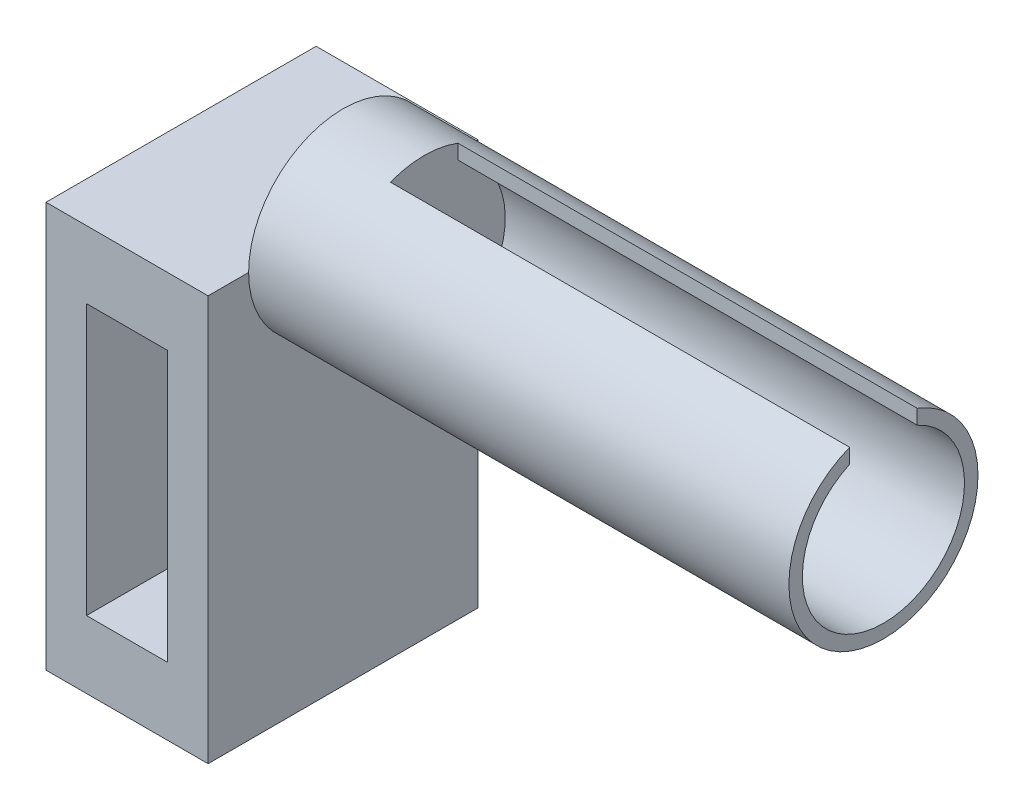
ISO-10303-21;
HEADER;
FILE_DESCRIPTION(('STEP AP214'),'2;1');
FILE_NAME('part.step','',(''),(''),'','','');
FILE_SCHEMA(('AUTOMOTIVE_DESIGN { 1 0 10303 214 1 1 1 1 }'));
ENDSEC;
DATA;
#1=APPLICATION_CONTEXT('core data for automotive mechanical design processes');
#2=APPLICATION_PROTOCOL_DEFINITION('international standard','automotive_design',2000,#1);
#3=PRODUCT_CONTEXT('',#1,'mechanical');
#4=PRODUCT('Part','Part','',(#3));
#5=PRODUCT_RELATED_PRODUCT_CATEGORY('part','',(#4));
#6=PRODUCT_DEFINITION_FORMATION('','',#4);
#7=PRODUCT_DEFINITION_CONTEXT('part definition',#1,'design');
#8=PRODUCT_DEFINITION('design','',#6,#7);
#9=PRODUCT_DEFINITION_SHAPE('','',#8);
#10=(LENGTH_UNIT() NAMED_UNIT(*) SI_UNIT(.MILLI.,.METRE.));
#11=(NAMED_UNIT(*) PLANE_ANGLE_UNIT() SI_UNIT($,.RADIAN.));
#12=(NAMED_UNIT(*) SI_UNIT($,.STERADIAN.) SOLID_ANGLE_UNIT());
#13=UNCERTAINTY_MEASURE_WITH_UNIT(LENGTH_MEASURE(1.E-05),#10,'distance_accuracy_value','');
#14=(GEOMETRIC_REPRESENTATION_CONTEXT(3) GLOBAL_UNCERTAINTY_ASSIGNED_CONTEXT((#13)) GLOBAL_UNIT_ASSIGNED_CONTEXT((#10,
#11,#12)) REPRESENTATION_CONTEXT('',''));
#15=CARTESIAN_POINT('',(0.,0.,0.));
#16=DIRECTION('',(0.,0.,1.));
#17=DIRECTION('',(1.,0.,0.));
#18=AXIS2_PLACEMENT_3D('',#15,#16,#17);
#19=CARTESIAN_POINT('',(3.,7.5,10.));
#20=DIRECTION('',(-1.,0.,0.));
#21=DIRECTION('',(0.,-1.,0.));
#22=AXIS2_PLACEMENT_3D('',#19,#20,#21);
#23=PLANE('',#22);
#24=CARTESIAN_POINT('',(3.,7.5,5.));
#25=DIRECTION('',(1.,0.,0.));
#26=DIRECTION('',(0.,1.,0.));
#27=AXIS2_PLACEMENT_3D('',#24,#25,#26);
#28=CIRCLE('',#27,3.5);
#29=CARTESIAN_POINT('',(3.,7.5,8.5));
#30=VERTEX_POINT('',#29);
#31=CARTESIAN_POINT('',(3.,7.5,1.5));
#32=VERTEX_POINT('',#31);
#33=EDGE_CURVE('E63',#30,#32,#28,.T.);
#34=ORIENTED_EDGE('',*,*,#33,.F.);
#35=DIRECTION('',(0.,0.,-1.));
#36=VECTOR('',#35,1.);
#37=CARTESIAN_POINT('',(3.,7.5,10.));
#38=LINE('',#37,#36);
#39=CARTESIAN_POINT('',(3.,7.5,10.));
#40=VERTEX_POINT('',#39);
#41=EDGE_CURVE('E11',#40,#30,#38,.T.);
#42=ORIENTED_EDGE('',*,*,#41,.F.);
#43=DIRECTION('',(0.,1.,0.));
#44=VECTOR('',#43,1.);
#45=CARTESIAN_POINT('',(3.,7.5,10.));
#46=LINE('',#45,#44);
#47=CARTESIAN_POINT('',(3.,-7.5,10.));
#48=VERTEX_POINT('',#47);
#49=EDGE_CURVE('E223',#48,#40,#46,.T.);
#50=ORIENTED_EDGE('',*,*,#49,.F.);
#51=DIRECTION('',(0.,0.,-1.));
#52=VECTOR('',#51,1.);
#53=CARTESIAN_POINT('',(3.,-7.5,10.));
#54=LINE('',#53,#52);
#55=CARTESIAN_POINT('',(3.,-7.5,0.));
#56=VERTEX_POINT('',#55);
#57=EDGE_CURVE('E237',#48,#56,#54,.T.);
#58=ORIENTED_EDGE('',*,*,#57,.T.);
#59=DIRECTION('',(0.,1.,0.));
#60=VECTOR('',#59,1.);
#61=CARTESIAN_POINT('',(3.,7.5,0.));
#62=LINE('',#61,#60);
#63=CARTESIAN_POINT('',(3.,7.5,0.));
#64=VERTEX_POINT('',#63);
#65=EDGE_CURVE('E213',#56,#64,#62,.T.);
#66=ORIENTED_EDGE('',*,*,#65,.T.);
#67=EDGE_CURVE('E48',#32,#64,#38,.T.);
#68=ORIENTED_EDGE('',*,*,#67,.F.);
#69=EDGE_LOOP('',(#34,#42,#50,#58,#66,#68));
#70=FACE_BOUND('',#69,.T.);
#71=ADVANCED_FACE('F39',(#70),#23,.F.);
#72=CARTESIAN_POINT('',(-3.,7.5,10.));
#73=DIRECTION('',(0.,-1.,0.));
#74=DIRECTION('',(0.,0.,-1.));
#75=AXIS2_PLACEMENT_3D('',#72,#73,#74);
#76=PLANE('',#75);
#77=DIRECTION('',(-1.,0.,0.));
#78=VECTOR('',#77,1.);
#79=CARTESIAN_POINT('',(-3.,7.5,0.));
#80=LINE('',#79,#78);
#81=CARTESIAN_POINT('',(-3.,7.5,0.));
#82=VERTEX_POINT('',#81);
#83=EDGE_CURVE('E241',#64,#82,#80,.T.);
#84=ORIENTED_EDGE('',*,*,#83,.T.);
#85=DIRECTION('',(0.,0.,-1.));
#86=VECTOR('',#85,1.);
#87=CARTESIAN_POINT('',(-3.,7.5,10.));
#88=LINE('',#87,#86);
#89=CARTESIAN_POINT('',(-3.,7.5,10.));
#90=VERTEX_POINT('',#89);
#91=EDGE_CURVE('E255',#90,#82,#88,.T.);
#92=ORIENTED_EDGE('',*,*,#91,.F.);
#93=DIRECTION('',(-1.,0.,0.));
#94=VECTOR('',#93,1.);
#95=CARTESIAN_POINT('',(-3.,7.5,10.));
#96=LINE('',#95,#94);
#97=EDGE_CURVE('E227',#40,#90,#96,.T.);
#98=ORIENTED_EDGE('',*,*,#97,.F.);
#99=ORIENTED_EDGE('',*,*,#41,.T.);
#100=EDGE_CURVE('E47',#30,#32,#38,.T.);
#101=ORIENTED_EDGE('',*,*,#100,.T.);
#102=ORIENTED_EDGE('',*,*,#67,.T.);
#103=EDGE_LOOP('',(#84,#92,#98,#99,#101,#102));
#104=FACE_BOUND('',#103,.T.);
#105=ADVANCED_FACE('F267',(#104),#76,.F.);
#106=CARTESIAN_POINT('',(-3.,7.5,10.));
#107=DIRECTION('',(1.,0.,0.));
#108=DIRECTION('',(0.,1.,0.));
#109=AXIS2_PLACEMENT_3D('',#106,#107,#108);
#110=PLANE('',#109);
#111=DIRECTION('',(0.,-1.,0.));
#112=VECTOR('',#111,1.);
#113=CARTESIAN_POINT('',(-3.,7.5,0.));
#114=LINE('',#113,#112);
#115=CARTESIAN_POINT('',(-3.,-7.5,0.));
#116=VERTEX_POINT('',#115);
#117=EDGE_CURVE('E244',#82,#116,#114,.T.);
#118=ORIENTED_EDGE('',*,*,#117,.T.);
#119=DIRECTION('',(0.,0.,-1.));
#120=VECTOR('',#119,1.);
#121=CARTESIAN_POINT('',(-3.,-7.5,10.));
#122=LINE('',#121,#120);
#123=CARTESIAN_POINT('',(-3.,-7.5,10.));
#124=VERTEX_POINT('',#123);
#125=EDGE_CURVE('E252',#124,#116,#122,.T.);
#126=ORIENTED_EDGE('',*,*,#125,.F.);
#127=DIRECTION('',(0.,-1.,0.));
#128=VECTOR('',#127,1.);
#129=CARTESIAN_POINT('',(-3.,7.5,10.));
#130=LINE('',#129,#128);
#131=EDGE_CURVE('E231',#90,#124,#130,.T.);
#132=ORIENTED_EDGE('',*,*,#131,.F.);
#133=ORIENTED_EDGE('',*,*,#91,.T.);
#134=EDGE_LOOP('',(#118,#126,#132,#133));
#135=FACE_BOUND('',#134,.T.);
#136=ADVANCED_FACE('F293',(#135),#110,.F.);
#137=CARTESIAN_POINT('',(-3.,-7.5,10.));
#138=DIRECTION('',(0.,1.,0.));
#139=DIRECTION('',(0.,0.,1.));
#140=AXIS2_PLACEMENT_3D('',#137,#138,#139);
#141=PLANE('',#140);
#142=DIRECTION('',(1.,0.,0.));
#143=VECTOR('',#142,1.);
#144=CARTESIAN_POINT('',(-3.,-7.5,0.));
#145=LINE('',#144,#143);
#146=EDGE_CURVE('E228',#116,#56,#145,.T.);
#147=ORIENTED_EDGE('',*,*,#146,.T.);
#148=ORIENTED_EDGE('',*,*,#57,.F.);
#149=DIRECTION('',(1.,0.,0.));
#150=VECTOR('',#149,1.);
#151=CARTESIAN_POINT('',(-3.,-7.5,10.));
#152=LINE('',#151,#150);
#153=EDGE_CURVE('E234',#124,#48,#152,.T.);
#154=ORIENTED_EDGE('',*,*,#153,.F.);
#155=ORIENTED_EDGE('',*,*,#125,.T.);
#156=EDGE_LOOP('',(#147,#148,#154,#155));
#157=FACE_BOUND('',#156,.T.);
#158=ADVANCED_FACE('F297',(#157),#141,.F.);
#159=CARTESIAN_POINT('',(0.,0.,10.));
#160=DIRECTION('',(0.,0.,1.));
#161=DIRECTION('',(1.,0.,0.));
#162=AXIS2_PLACEMENT_3D('',#159,#160,#161);
#163=PLANE('',#162);
#164=DIRECTION('',(0.,1.,0.));
#165=VECTOR('',#164,1.);
#166=CARTESIAN_POINT('',(1.5,5.,10.));
#167=LINE('',#166,#165);
#168=CARTESIAN_POINT('',(1.5,-5.,10.));
#169=VERTEX_POINT('',#168);
#170=CARTESIAN_POINT('',(1.5,5.,10.));
#171=VERTEX_POINT('',#170);
#172=EDGE_CURVE('E176',#169,#171,#167,.T.);
#173=ORIENTED_EDGE('',*,*,#172,.F.);
#174=DIRECTION('',(1.,0.,0.));
#175=VECTOR('',#174,1.);
#176=CARTESIAN_POINT('',(-1.5,-5.,10.));
#177=LINE('',#176,#175);
#178=CARTESIAN_POINT('',(-1.5,-5.,10.));
#179=VERTEX_POINT('',#178);
#180=EDGE_CURVE('E184',#179,#169,#177,.T.);
#181=ORIENTED_EDGE('',*,*,#180,.F.);
#182=DIRECTION('',(0.,-1.,0.));
#183=VECTOR('',#182,1.);
#184=CARTESIAN_POINT('',(-1.5,5.,10.));
#185=LINE('',#184,#183);
#186=CARTESIAN_POINT('',(-1.5,5.,10.));
#187=VERTEX_POINT('',#186);
#188=EDGE_CURVE('E203',#187,#179,#185,.T.);
#189=ORIENTED_EDGE('',*,*,#188,.F.);
#190=DIRECTION('',(-1.,0.,0.));
#191=VECTOR('',#190,1.);
#192=CARTESIAN_POINT('',(-1.5,5.,10.));
#193=LINE('',#192,#191);
#194=EDGE_CURVE('E199',#171,#187,#193,.T.);
#195=ORIENTED_EDGE('',*,*,#194,.F.);
#196=EDGE_LOOP('',(#173,#181,#189,#195));
#197=FACE_BOUND('',#196,.T.);
#198=ORIENTED_EDGE('',*,*,#49,.T.);
#199=ORIENTED_EDGE('',*,*,#97,.T.);
#200=ORIENTED_EDGE('',*,*,#131,.T.);
#201=ORIENTED_EDGE('',*,*,#153,.T.);
#202=EDGE_LOOP('',(#198,#199,#200,#201));
#203=FACE_BOUND('',#202,.T.);
#204=ADVANCED_FACE('F302',(#197,#203),#163,.T.);
#205=CARTESIAN_POINT('',(0.,0.,0.));
#206=DIRECTION('',(0.,0.,1.));
#207=DIRECTION('',(1.,0.,0.));
#208=AXIS2_PLACEMENT_3D('',#205,#206,#207);
#209=PLANE('',#208);
#210=ORIENTED_EDGE('',*,*,#65,.F.);
#211=ORIENTED_EDGE('',*,*,#146,.F.);
#212=ORIENTED_EDGE('',*,*,#117,.F.);
#213=ORIENTED_EDGE('',*,*,#83,.F.);
#214=EDGE_LOOP('',(#210,#211,#212,#213));
#215=FACE_BOUND('',#214,.T.);
#216=ADVANCED_FACE('F304',(#215),#209,.F.);
#217=CARTESIAN_POINT('',(1.5,5.,3.));
#218=DIRECTION('',(1.,0.,0.));
#219=DIRECTION('',(0.,1.,0.));
#220=AXIS2_PLACEMENT_3D('',#217,#218,#219);
#221=PLANE('',#220);
#222=ORIENTED_EDGE('',*,*,#172,.T.);
#223=DIRECTION('',(0.,0.,1.));
#224=VECTOR('',#223,1.);
#225=CARTESIAN_POINT('',(1.5,5.,3.));
#226=LINE('',#225,#224);
#227=CARTESIAN_POINT('',(1.5,5.,3.));
#228=VERTEX_POINT('',#227);
#229=EDGE_CURVE('E196',#228,#171,#226,.T.);
#230=ORIENTED_EDGE('',*,*,#229,.F.);
#231=DIRECTION('',(0.,1.,0.));
#232=VECTOR('',#231,1.);
#233=CARTESIAN_POINT('',(1.5,5.,3.));
#234=LINE('',#233,#232);
#235=CARTESIAN_POINT('',(1.5,-5.,3.));
#236=VERTEX_POINT('',#235);
#237=EDGE_CURVE('E179',#236,#228,#234,.T.);
#238=ORIENTED_EDGE('',*,*,#237,.F.);
#239=DIRECTION('',(0.,0.,1.));
#240=VECTOR('',#239,1.);
#241=CARTESIAN_POINT('',(1.5,-5.,3.));
#242=LINE('',#241,#240);
#243=EDGE_CURVE('E210',#236,#169,#242,.T.);
#244=ORIENTED_EDGE('',*,*,#243,.T.);
#245=EDGE_LOOP('',(#222,#230,#238,#244));
#246=FACE_BOUND('',#245,.T.);
#247=ADVANCED_FACE('F307',(#246),#221,.F.);
#248=CARTESIAN_POINT('',(-1.5,-5.,3.));
#249=DIRECTION('',(0.,-1.,0.));
#250=DIRECTION('',(0.,0.,-1.));
#251=AXIS2_PLACEMENT_3D('',#248,#249,#250);
#252=PLANE('',#251);
#253=ORIENTED_EDGE('',*,*,#180,.T.);
#254=ORIENTED_EDGE('',*,*,#243,.F.);
#255=DIRECTION('',(1.,0.,0.));
#256=VECTOR('',#255,1.);
#257=CARTESIAN_POINT('',(-1.5,-5.,3.));
#258=LINE('',#257,#256);
#259=CARTESIAN_POINT('',(-1.5,-5.,3.));
#260=VERTEX_POINT('',#259);
#261=EDGE_CURVE('E192',#260,#236,#258,.T.);
#262=ORIENTED_EDGE('',*,*,#261,.F.);
#263=DIRECTION('',(0.,0.,1.));
#264=VECTOR('',#263,1.);
#265=CARTESIAN_POINT('',(-1.5,-5.,3.));
#266=LINE('',#265,#264);
#267=EDGE_CURVE('E214',#260,#179,#266,.T.);
#268=ORIENTED_EDGE('',*,*,#267,.T.);
#269=EDGE_LOOP('',(#253,#254,#262,#268));
#270=FACE_BOUND('',#269,.T.);
#271=ADVANCED_FACE('F314',(#270),#252,.F.);
#272=CARTESIAN_POINT('',(-1.5,5.,3.));
#273=DIRECTION('',(-1.,0.,0.));
#274=DIRECTION('',(0.,-1.,0.));
#275=AXIS2_PLACEMENT_3D('',#272,#273,#274);
#276=PLANE('',#275);
#277=ORIENTED_EDGE('',*,*,#188,.T.);
#278=ORIENTED_EDGE('',*,*,#267,.F.);
#279=DIRECTION('',(0.,-1.,0.));
#280=VECTOR('',#279,1.);
#281=CARTESIAN_POINT('',(-1.5,5.,3.));
#282=LINE('',#281,#280);
#283=CARTESIAN_POINT('',(-1.5,5.,3.));
#284=VERTEX_POINT('',#283);
#285=EDGE_CURVE('E188',#284,#260,#282,.T.);
#286=ORIENTED_EDGE('',*,*,#285,.F.);
#287=DIRECTION('',(0.,0.,1.));
#288=VECTOR('',#287,1.);
#289=CARTESIAN_POINT('',(-1.5,5.,3.));
#290=LINE('',#289,#288);
#291=EDGE_CURVE('E217',#284,#187,#290,.T.);
#292=ORIENTED_EDGE('',*,*,#291,.T.);
#293=EDGE_LOOP('',(#277,#278,#286,#292));
#294=FACE_BOUND('',#293,.T.);
#295=ADVANCED_FACE('F318',(#294),#276,.F.);
#296=CARTESIAN_POINT('',(-1.5,5.,3.));
#297=DIRECTION('',(0.,1.,0.));
#298=DIRECTION('',(0.,0.,1.));
#299=AXIS2_PLACEMENT_3D('',#296,#297,#298);
#300=PLANE('',#299);
#301=ORIENTED_EDGE('',*,*,#194,.T.);
#302=ORIENTED_EDGE('',*,*,#291,.F.);
#303=DIRECTION('',(-1.,0.,0.));
#304=VECTOR('',#303,1.);
#305=CARTESIAN_POINT('',(-1.5,5.,3.));
#306=LINE('',#305,#304);
#307=EDGE_CURVE('E183',#228,#284,#306,.T.);
#308=ORIENTED_EDGE('',*,*,#307,.F.);
#309=ORIENTED_EDGE('',*,*,#229,.T.);
#310=EDGE_LOOP('',(#301,#302,#308,#309));
#311=FACE_BOUND('',#310,.T.);
#312=ADVANCED_FACE('F285',(#311),#300,.F.);
#313=CARTESIAN_POINT('',(0.,0.,3.));
#314=DIRECTION('',(0.,0.,1.));
#315=DIRECTION('',(1.,0.,0.));
#316=AXIS2_PLACEMENT_3D('',#313,#314,#315);
#317=PLANE('',#316);
#318=ORIENTED_EDGE('',*,*,#237,.T.);
#319=ORIENTED_EDGE('',*,*,#307,.T.);
#320=ORIENTED_EDGE('',*,*,#285,.T.);
#321=ORIENTED_EDGE('',*,*,#261,.T.);
#322=EDGE_LOOP('',(#318,#319,#320,#321));
#323=FACE_BOUND('',#322,.T.);
#324=ADVANCED_FACE('F277',(#323),#317,.T.);
#325=CARTESIAN_POINT('',(23.,7.5,5.));
#326=DIRECTION('',(-1.,0.,0.));
#327=DIRECTION('',(0.,-1.,0.));
#328=AXIS2_PLACEMENT_3D('',#325,#326,#327);
#329=CYLINDRICAL_SURFACE('',#328,3.5);
#330=CARTESIAN_POINT('',(23.,7.5,5.));
#331=DIRECTION('',(1.,0.,0.));
#332=DIRECTION('',(0.,1.,0.));
#333=AXIS2_PLACEMENT_3D('',#330,#331,#332);
#334=CIRCLE('',#333,3.5);
#335=CARTESIAN_POINT('',(23.,10.7691742076555,6.25));
#336=VERTEX_POINT('',#335);
#337=CARTESIAN_POINT('',(23.,10.7691742076555,3.75));
#338=VERTEX_POINT('',#337);
#339=EDGE_CURVE('E156',#336,#338,#334,.T.);
#340=ORIENTED_EDGE('',*,*,#339,.F.);
#341=DIRECTION('',(-1.,0.,0.));
#342=VECTOR('',#341,1.);
#343=CARTESIAN_POINT('',(23.,10.7691742076555,6.25));
#344=LINE('',#343,#342);
#345=CARTESIAN_POINT('',(6.,10.7691742076555,6.25));
#346=VERTEX_POINT('',#345);
#347=EDGE_CURVE('E171',#336,#346,#344,.T.);
#348=ORIENTED_EDGE('',*,*,#347,.T.);
#349=CARTESIAN_POINT('',(6.,7.5,5.));
#350=DIRECTION('',(1.,0.,0.));
#351=DIRECTION('',(0.,0.,-1.));
#352=AXIS2_PLACEMENT_3D('',#349,#350,#351);
#353=CIRCLE('',#352,3.5);
#354=CARTESIAN_POINT('',(6.,10.7691742076555,3.75));
#355=VERTEX_POINT('',#354);
#356=EDGE_CURVE('E165',#355,#346,#353,.T.);
#357=ORIENTED_EDGE('',*,*,#356,.F.);
#358=DIRECTION('',(-1.,0.,0.));
#359=VECTOR('',#358,1.);
#360=CARTESIAN_POINT('',(23.,10.7691742076555,3.75));
#361=LINE('',#360,#359);
#362=EDGE_CURVE('E147',#355,#338,#361,.F.);
#363=ORIENTED_EDGE('',*,*,#362,.T.);
#364=EDGE_LOOP('',(#340,#348,#357,#363));
#365=FACE_BOUND('',#364,.T.);
#366=ORIENTED_EDGE('',*,*,#33,.T.);
#367=EDGE_CURVE('E169',#32,#30,#28,.T.);
#368=ORIENTED_EDGE('',*,*,#367,.T.);
#369=EDGE_LOOP('',(#366,#368));
#370=FACE_BOUND('',#369,.T.);
#371=ADVANCED_FACE('F275',(#365,#370),#329,.T.);
#372=CARTESIAN_POINT('',(23.,7.5,5.));
#373=DIRECTION('',(1.,0.,0.));
#374=DIRECTION('',(0.,1.,0.));
#375=AXIS2_PLACEMENT_3D('',#372,#373,#374);
#376=PLANE('',#375);
#377=DIRECTION('',(0.,-1.,0.));
#378=VECTOR('',#377,1.);
#379=CARTESIAN_POINT('',(23.,10.,6.25));
#380=LINE('',#379,#378);
#381=CARTESIAN_POINT('',(23.,10.2271780286589,6.25));
#382=VERTEX_POINT('',#381);
#383=EDGE_CURVE('E158',#336,#382,#380,.T.);
#384=ORIENTED_EDGE('',*,*,#383,.F.);
#385=ORIENTED_EDGE('',*,*,#339,.T.);
#386=DIRECTION('',(0.,1.,0.));
#387=VECTOR('',#386,1.);
#388=CARTESIAN_POINT('',(23.,10.,3.75));
#389=LINE('',#388,#387);
#390=CARTESIAN_POINT('',(23.,10.2271780286589,3.75));
#391=VERTEX_POINT('',#390);
#392=EDGE_CURVE('E139',#391,#338,#389,.T.);
#393=ORIENTED_EDGE('',*,*,#392,.F.);
#394=CARTESIAN_POINT('',(23.,7.5,5.));
#395=DIRECTION('',(1.,0.,0.));
#396=DIRECTION('',(0.,1.,0.));
#397=AXIS2_PLACEMENT_3D('',#394,#395,#396);
#398=CIRCLE('',#397,3.);
#399=EDGE_CURVE('E154',#382,#391,#398,.T.);
#400=ORIENTED_EDGE('',*,*,#399,.F.);
#401=EDGE_LOOP('',(#384,#385,#393,#400));
#402=FACE_BOUND('',#401,.T.);
#403=ADVANCED_FACE('F153',(#402),#376,.T.);
#404=CARTESIAN_POINT('',(3.,7.5,5.));
#405=DIRECTION('',(1.,0.,0.));
#406=DIRECTION('',(0.,1.,0.));
#407=AXIS2_PLACEMENT_3D('',#404,#405,#406);
#408=PLANE('',#407);
#409=ORIENTED_EDGE('',*,*,#100,.F.);
#410=ORIENTED_EDGE('',*,*,#367,.F.);
#411=EDGE_LOOP('',(#409,#410));
#412=FACE_BOUND('',#411,.T.);
#413=ADVANCED_FACE('F272',(#412),#408,.F.);
#414=CARTESIAN_POINT('',(6.,7.5,5.));
#415=DIRECTION('',(1.,0.,0.));
#416=DIRECTION('',(0.,1.,0.));
#417=AXIS2_PLACEMENT_3D('',#414,#415,#416);
#418=CYLINDRICAL_SURFACE('',#417,3.);
#419=CARTESIAN_POINT('',(6.,7.5,5.));
#420=DIRECTION('',(1.,0.,0.));
#421=DIRECTION('',(0.,1.,0.));
#422=AXIS2_PLACEMENT_3D('',#419,#420,#421);
#423=CIRCLE('',#422,3.);
#424=CARTESIAN_POINT('',(6.,10.2271780286589,6.25));
#425=VERTEX_POINT('',#424);
#426=CARTESIAN_POINT('',(6.,10.2271780286589,3.75));
#427=VERTEX_POINT('',#426);
#428=EDGE_CURVE('E164',#425,#427,#423,.T.);
#429=ORIENTED_EDGE('',*,*,#428,.F.);
#430=DIRECTION('',(1.,0.,0.));
#431=VECTOR('',#430,1.);
#432=CARTESIAN_POINT('',(6.,10.2271780286589,6.25));
#433=LINE('',#432,#431);
#434=EDGE_CURVE('E162',#425,#382,#433,.T.);
#435=ORIENTED_EDGE('',*,*,#434,.T.);
#436=ORIENTED_EDGE('',*,*,#399,.T.);
#437=DIRECTION('',(1.,0.,0.));
#438=VECTOR('',#437,1.);
#439=CARTESIAN_POINT('',(6.,10.2271780286589,3.75));
#440=LINE('',#439,#438);
#441=EDGE_CURVE('E136',#391,#427,#440,.F.);
#442=ORIENTED_EDGE('',*,*,#441,.T.);
#443=EDGE_LOOP('',(#429,#435,#436,#442));
#444=FACE_BOUND('',#443,.T.);
#445=ADVANCED_FACE('F161',(#444),#418,.F.);
#446=CARTESIAN_POINT('',(6.,7.5,5.));
#447=DIRECTION('',(1.,0.,0.));
#448=DIRECTION('',(0.,1.,0.));
#449=AXIS2_PLACEMENT_3D('',#446,#447,#448);
#450=PLANE('',#449);
#451=ORIENTED_EDGE('',*,*,#428,.T.);
#452=DIRECTION('',(0.,1.,0.));
#453=VECTOR('',#452,1.);
#454=CARTESIAN_POINT('',(6.,10.,3.75));
#455=LINE('',#454,#453);
#456=EDGE_CURVE('E142',#427,#355,#455,.T.);
#457=ORIENTED_EDGE('',*,*,#456,.T.);
#458=ORIENTED_EDGE('',*,*,#356,.T.);
#459=DIRECTION('',(0.,-1.,0.));
#460=VECTOR('',#459,1.);
#461=CARTESIAN_POINT('',(6.,10.,6.25));
#462=LINE('',#461,#460);
#463=EDGE_CURVE('E55',#346,#425,#462,.T.);
#464=ORIENTED_EDGE('',*,*,#463,.T.);
#465=EDGE_LOOP('',(#451,#457,#458,#464));
#466=FACE_BOUND('',#465,.T.);
#467=ADVANCED_FACE('F390',(#466),#450,.T.);
#468=CARTESIAN_POINT('',(6.,10.,6.25));
#469=DIRECTION('',(0.,0.,1.));
#470=DIRECTION('',(1.,0.,0.));
#471=AXIS2_PLACEMENT_3D('',#468,#469,#470);
#472=PLANE('',#471);
#473=ORIENTED_EDGE('',*,*,#383,.T.);
#474=ORIENTED_EDGE('',*,*,#434,.F.);
#475=ORIENTED_EDGE('',*,*,#463,.F.);
#476=ORIENTED_EDGE('',*,*,#347,.F.);
#477=EDGE_LOOP('',(#473,#474,#475,#476));
#478=FACE_BOUND('',#477,.T.);
#479=ADVANCED_FACE('F400',(#478),#472,.F.);
#480=CARTESIAN_POINT('',(6.,10.,3.75));
#481=DIRECTION('',(0.,0.,-1.));
#482=DIRECTION('',(-1.,0.,0.));
#483=AXIS2_PLACEMENT_3D('',#480,#481,#482);
#484=PLANE('',#483);
#485=ORIENTED_EDGE('',*,*,#456,.F.);
#486=ORIENTED_EDGE('',*,*,#441,.F.);
#487=ORIENTED_EDGE('',*,*,#392,.T.);
#488=ORIENTED_EDGE('',*,*,#362,.F.);
#489=EDGE_LOOP('',(#485,#486,#487,#488));
#490=FACE_BOUND('',#489,.T.);
#491=ADVANCED_FACE('F138',(#490),#484,.F.);
#492=CLOSED_SHELL('',(#71,#105,#136,#158,#204,#216,#247,#271,#295,#312,#324,#371,#403,#413,#445,
#467,#479,#491));
#493=MANIFOLD_SOLID_BREP('B2',#492);
#494=ADVANCED_BREP_SHAPE_REPRESENTATION('',(#18,#493),#14);
#495=SHAPE_DEFINITION_REPRESENTATION(#9,#494);
ENDSEC;
END-ISO-10303-21;
